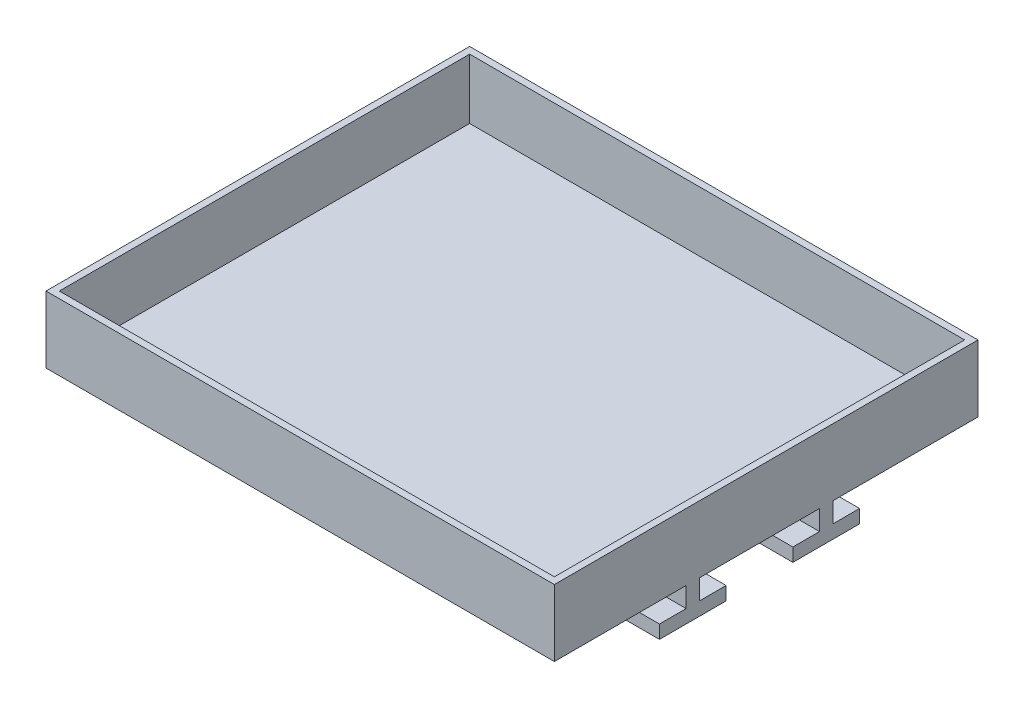
ISO-10303-21;
HEADER;
FILE_DESCRIPTION(('STEP AP214'),'2;1');
FILE_NAME('part.step','',(''),(''),'','','');
FILE_SCHEMA(('AUTOMOTIVE_DESIGN { 1 0 10303 214 1 1 1 1 }'));
ENDSEC;
DATA;
#1=APPLICATION_CONTEXT('core data for automotive mechanical design processes');
#2=APPLICATION_PROTOCOL_DEFINITION('international standard','automotive_design',2000,#1);
#3=PRODUCT_CONTEXT('',#1,'mechanical');
#4=PRODUCT('Part','Part','',(#3));
#5=PRODUCT_RELATED_PRODUCT_CATEGORY('part','',(#4));
#6=PRODUCT_DEFINITION_FORMATION('','',#4);
#7=PRODUCT_DEFINITION_CONTEXT('part definition',#1,'design');
#8=PRODUCT_DEFINITION('design','',#6,#7);
#9=PRODUCT_DEFINITION_SHAPE('','',#8);
#10=(LENGTH_UNIT() NAMED_UNIT(*) SI_UNIT(.MILLI.,.METRE.));
#11=(NAMED_UNIT(*) PLANE_ANGLE_UNIT() SI_UNIT($,.RADIAN.));
#12=(NAMED_UNIT(*) SI_UNIT($,.STERADIAN.) SOLID_ANGLE_UNIT());
#13=UNCERTAINTY_MEASURE_WITH_UNIT(LENGTH_MEASURE(1.E-05),#10,'distance_accuracy_value','');
#14=(GEOMETRIC_REPRESENTATION_CONTEXT(3) GLOBAL_UNCERTAINTY_ASSIGNED_CONTEXT((#13)) GLOBAL_UNIT_ASSIGNED_CONTEXT((#10,
#11,#12)) REPRESENTATION_CONTEXT('',''));
#15=CARTESIAN_POINT('',(0.,0.,0.));
#16=DIRECTION('',(0.,0.,1.));
#17=DIRECTION('',(1.,0.,0.));
#18=AXIS2_PLACEMENT_3D('',#15,#16,#17);
#19=CARTESIAN_POINT('',(0.,0.,0.));
#20=DIRECTION('',(0.,1.,0.));
#21=DIRECTION('',(0.,0.,1.));
#22=AXIS2_PLACEMENT_3D('',#19,#20,#21);
#23=PLANE('',#22);
#24=DIRECTION('',(1.,0.,0.));
#25=VECTOR('',#24,1.);
#26=CARTESIAN_POINT('',(-49.2803398874989,0.,12.));
#27=LINE('',#26,#25);
#28=CARTESIAN_POINT('',(-38.1,0.,12.));
#29=VERTEX_POINT('',#28);
#30=CARTESIAN_POINT('',(38.1,0.,12.));
#31=VERTEX_POINT('',#30);
#32=EDGE_CURVE('E59',#29,#31,#27,.T.);
#33=ORIENTED_EDGE('',*,*,#32,.T.);
#34=DIRECTION('',(0.,0.,-1.));
#35=VECTOR('',#34,1.);
#36=CARTESIAN_POINT('',(38.1,0.,-31.75));
#37=LINE('',#36,#35);
#38=CARTESIAN_POINT('',(38.1,0.,31.75));
#39=VERTEX_POINT('',#38);
#40=EDGE_CURVE('E231',#39,#31,#37,.T.);
#41=ORIENTED_EDGE('',*,*,#40,.F.);
#42=DIRECTION('',(1.,0.,0.));
#43=VECTOR('',#42,1.);
#44=CARTESIAN_POINT('',(-38.1,0.,31.75));
#45=LINE('',#44,#43);
#46=CARTESIAN_POINT('',(-38.1,0.,31.75));
#47=VERTEX_POINT('',#46);
#48=EDGE_CURVE('E249',#47,#39,#45,.T.);
#49=ORIENTED_EDGE('',*,*,#48,.F.);
#50=DIRECTION('',(0.,0.,1.));
#51=VECTOR('',#50,1.);
#52=CARTESIAN_POINT('',(-38.1,0.,-31.75));
#53=LINE('',#52,#51);
#54=EDGE_CURVE('E244',#29,#47,#53,.T.);
#55=ORIENTED_EDGE('',*,*,#54,.F.);
#56=EDGE_LOOP('',(#33,#41,#49,#55));
#57=FACE_BOUND('',#56,.T.);
#58=ADVANCED_FACE('F43',(#57),#23,.F.);
#59=DIRECTION('',(1.,0.,0.));
#60=VECTOR('',#59,1.);
#61=CARTESIAN_POINT('',(-49.2803398874989,0.,-10.));
#62=LINE('',#61,#60);
#63=CARTESIAN_POINT('',(-38.1,0.,-10.));
#64=VERTEX_POINT('',#63);
#65=CARTESIAN_POINT('',(38.1,0.,-10.));
#66=VERTEX_POINT('',#65);
#67=EDGE_CURVE('E276',#64,#66,#62,.T.);
#68=ORIENTED_EDGE('',*,*,#67,.F.);
#69=CARTESIAN_POINT('',(-38.1,0.,-31.75));
#70=VERTEX_POINT('',#69);
#71=EDGE_CURVE('E245',#70,#64,#53,.T.);
#72=ORIENTED_EDGE('',*,*,#71,.F.);
#73=DIRECTION('',(-1.,0.,0.));
#74=VECTOR('',#73,1.);
#75=CARTESIAN_POINT('',(-38.1,0.,-31.75));
#76=LINE('',#75,#74);
#77=CARTESIAN_POINT('',(38.1,0.,-31.75));
#78=VERTEX_POINT('',#77);
#79=EDGE_CURVE('E236',#78,#70,#76,.T.);
#80=ORIENTED_EDGE('',*,*,#79,.F.);
#81=EDGE_CURVE('E232',#66,#78,#37,.T.);
#82=ORIENTED_EDGE('',*,*,#81,.F.);
#83=EDGE_LOOP('',(#68,#72,#80,#82));
#84=FACE_BOUND('',#83,.T.);
#85=ADVANCED_FACE('F274',(#84),#23,.F.);
#86=CARTESIAN_POINT('',(38.1,10.,-31.75));
#87=DIRECTION('',(-1.,0.,0.));
#88=DIRECTION('',(0.,0.,1.));
#89=AXIS2_PLACEMENT_3D('',#86,#87,#88);
#90=PLANE('',#89);
#91=ORIENTED_EDGE('',*,*,#40,.T.);
#92=DIRECTION('',(0.,1.,0.));
#93=VECTOR('',#92,1.);
#94=CARTESIAN_POINT('',(38.1,-3.,12.));
#95=LINE('',#94,#93);
#96=CARTESIAN_POINT('',(38.1,-3.,12.));
#97=VERTEX_POINT('',#96);
#98=EDGE_CURVE('E224',#97,#31,#95,.T.);
#99=ORIENTED_EDGE('',*,*,#98,.F.);
#100=DIRECTION('',(0.,0.,-1.));
#101=VECTOR('',#100,1.);
#102=CARTESIAN_POINT('',(38.1,-3.,16.));
#103=LINE('',#102,#101);
#104=CARTESIAN_POINT('',(38.1,-3.,16.));
#105=VERTEX_POINT('',#104);
#106=EDGE_CURVE('E477',#105,#97,#103,.T.);
#107=ORIENTED_EDGE('',*,*,#106,.F.);
#108=DIRECTION('',(0.,1.,0.));
#109=VECTOR('',#108,1.);
#110=CARTESIAN_POINT('',(38.1,-5.,16.));
#111=LINE('',#110,#109);
#112=CARTESIAN_POINT('',(38.1,-5.,16.));
#113=VERTEX_POINT('',#112);
#114=EDGE_CURVE('E481',#113,#105,#111,.T.);
#115=ORIENTED_EDGE('',*,*,#114,.F.);
#116=DIRECTION('',(0.,0.,-1.));
#117=VECTOR('',#116,1.);
#118=CARTESIAN_POINT('',(38.1,-5.,16.));
#119=LINE('',#118,#117);
#120=CARTESIAN_POINT('',(38.1,-5.,6.));
#121=VERTEX_POINT('',#120);
#122=EDGE_CURVE('E485',#113,#121,#119,.T.);
#123=ORIENTED_EDGE('',*,*,#122,.T.);
#124=DIRECTION('',(0.,1.,0.));
#125=VECTOR('',#124,1.);
#126=CARTESIAN_POINT('',(38.1,-5.,6.));
#127=LINE('',#126,#125);
#128=CARTESIAN_POINT('',(38.1,-3.,6.));
#129=VERTEX_POINT('',#128);
#130=EDGE_CURVE('E489',#121,#129,#127,.T.);
#131=ORIENTED_EDGE('',*,*,#130,.T.);
#132=DIRECTION('',(0.,0.,-1.));
#133=VECTOR('',#132,1.);
#134=CARTESIAN_POINT('',(38.1,-3.,10.));
#135=LINE('',#134,#133);
#136=CARTESIAN_POINT('',(38.1,-3.,10.));
#137=VERTEX_POINT('',#136);
#138=EDGE_CURVE('E217',#137,#129,#135,.T.);
#139=ORIENTED_EDGE('',*,*,#138,.F.);
#140=DIRECTION('',(0.,1.,0.));
#141=VECTOR('',#140,1.);
#142=CARTESIAN_POINT('',(38.1,-3.,10.));
#143=LINE('',#142,#141);
#144=CARTESIAN_POINT('',(38.1,0.,10.));
#145=VERTEX_POINT('',#144);
#146=EDGE_CURVE('E211',#137,#145,#143,.T.);
#147=ORIENTED_EDGE('',*,*,#146,.T.);
#148=CARTESIAN_POINT('',(38.1,0.,-8.));
#149=VERTEX_POINT('',#148);
#150=EDGE_CURVE('E67',#145,#149,#37,.T.);
#151=ORIENTED_EDGE('',*,*,#150,.T.);
#152=DIRECTION('',(0.,1.,0.));
#153=VECTOR('',#152,1.);
#154=CARTESIAN_POINT('',(38.1,-3.,-8.));
#155=LINE('',#154,#153);
#156=CARTESIAN_POINT('',(38.1,-3.,-8.));
#157=VERTEX_POINT('',#156);
#158=EDGE_CURVE('E537',#157,#149,#155,.T.);
#159=ORIENTED_EDGE('',*,*,#158,.F.);
#160=DIRECTION('',(0.,0.,-1.));
#161=VECTOR('',#160,1.);
#162=CARTESIAN_POINT('',(38.1,-3.,-4.));
#163=LINE('',#162,#161);
#164=CARTESIAN_POINT('',(38.1,-3.,-4.));
#165=VERTEX_POINT('',#164);
#166=EDGE_CURVE('E540',#165,#157,#163,.T.);
#167=ORIENTED_EDGE('',*,*,#166,.F.);
#168=DIRECTION('',(0.,1.,0.));
#169=VECTOR('',#168,1.);
#170=CARTESIAN_POINT('',(38.1,-5.,-4.));
#171=LINE('',#170,#169);
#172=CARTESIAN_POINT('',(38.1,-5.,-4.));
#173=VERTEX_POINT('',#172);
#174=EDGE_CURVE('E544',#173,#165,#171,.T.);
#175=ORIENTED_EDGE('',*,*,#174,.F.);
#176=DIRECTION('',(0.,0.,-1.));
#177=VECTOR('',#176,1.);
#178=CARTESIAN_POINT('',(38.1,-5.,-4.));
#179=LINE('',#178,#177);
#180=CARTESIAN_POINT('',(38.1,-5.,-14.));
#181=VERTEX_POINT('',#180);
#182=EDGE_CURVE('E548',#173,#181,#179,.T.);
#183=ORIENTED_EDGE('',*,*,#182,.T.);
#184=DIRECTION('',(0.,1.,0.));
#185=VECTOR('',#184,1.);
#186=CARTESIAN_POINT('',(38.1,-5.,-14.));
#187=LINE('',#186,#185);
#188=CARTESIAN_POINT('',(38.1,-3.,-14.));
#189=VERTEX_POINT('',#188);
#190=EDGE_CURVE('E288',#181,#189,#187,.T.);
#191=ORIENTED_EDGE('',*,*,#190,.T.);
#192=DIRECTION('',(0.,0.,-1.));
#193=VECTOR('',#192,1.);
#194=CARTESIAN_POINT('',(38.1,-3.,-10.));
#195=LINE('',#194,#193);
#196=CARTESIAN_POINT('',(38.1,-3.,-10.));
#197=VERTEX_POINT('',#196);
#198=EDGE_CURVE('E281',#197,#189,#195,.T.);
#199=ORIENTED_EDGE('',*,*,#198,.F.);
#200=DIRECTION('',(0.,1.,0.));
#201=VECTOR('',#200,1.);
#202=CARTESIAN_POINT('',(38.1,-3.,-10.));
#203=LINE('',#202,#201);
#204=EDGE_CURVE('E473',#197,#66,#203,.T.);
#205=ORIENTED_EDGE('',*,*,#204,.T.);
#206=ORIENTED_EDGE('',*,*,#81,.T.);
#207=DIRECTION('',(0.,-1.,0.));
#208=VECTOR('',#207,1.);
#209=CARTESIAN_POINT('',(38.1,10.,-31.75));
#210=LINE('',#209,#208);
#211=CARTESIAN_POINT('',(38.1,10.,-31.75));
#212=VERTEX_POINT('',#211);
#213=EDGE_CURVE('E11',#212,#78,#210,.T.);
#214=ORIENTED_EDGE('',*,*,#213,.F.);
#215=DIRECTION('',(0.,0.,-1.));
#216=VECTOR('',#215,1.);
#217=CARTESIAN_POINT('',(38.1,10.,-31.75));
#218=LINE('',#217,#216);
#219=CARTESIAN_POINT('',(38.1,10.,31.75));
#220=VERTEX_POINT('',#219);
#221=EDGE_CURVE('E253',#220,#212,#218,.T.);
#222=ORIENTED_EDGE('',*,*,#221,.F.);
#223=DIRECTION('',(0.,-1.,0.));
#224=VECTOR('',#223,1.);
#225=CARTESIAN_POINT('',(38.1,10.,31.75));
#226=LINE('',#225,#224);
#227=EDGE_CURVE('E254',#220,#39,#226,.T.);
#228=ORIENTED_EDGE('',*,*,#227,.T.);
#229=EDGE_LOOP('',(#91,#99,#107,#115,#123,#131,#139,#147,#151,#159,#167,#175,#183,#191,#199,
#205,#206,#214,#222,#228));
#230=FACE_BOUND('',#229,.T.);
#231=ADVANCED_FACE('F45',(#230),#90,.F.);
#232=CARTESIAN_POINT('',(-38.1,10.,-31.75));
#233=DIRECTION('',(0.,0.,1.));
#234=DIRECTION('',(1.,0.,0.));
#235=AXIS2_PLACEMENT_3D('',#232,#233,#234);
#236=PLANE('',#235);
#237=ORIENTED_EDGE('',*,*,#79,.T.);
#238=DIRECTION('',(0.,-1.,0.));
#239=VECTOR('',#238,1.);
#240=CARTESIAN_POINT('',(-38.1,10.,-31.75));
#241=LINE('',#240,#239);
#242=CARTESIAN_POINT('',(-38.1,10.,-31.75));
#243=VERTEX_POINT('',#242);
#244=EDGE_CURVE('E52',#243,#70,#241,.T.);
#245=ORIENTED_EDGE('',*,*,#244,.F.);
#246=DIRECTION('',(-1.,0.,0.));
#247=VECTOR('',#246,1.);
#248=CARTESIAN_POINT('',(-38.1,10.,-31.75));
#249=LINE('',#248,#247);
#250=EDGE_CURVE('E337',#212,#243,#249,.T.);
#251=ORIENTED_EDGE('',*,*,#250,.F.);
#252=ORIENTED_EDGE('',*,*,#213,.T.);
#253=EDGE_LOOP('',(#237,#245,#251,#252));
#254=FACE_BOUND('',#253,.T.);
#255=ADVANCED_FACE('F351',(#254),#236,.F.);
#256=CARTESIAN_POINT('',(-38.1,10.,-31.75));
#257=DIRECTION('',(1.,0.,0.));
#258=DIRECTION('',(0.,0.,-1.));
#259=AXIS2_PLACEMENT_3D('',#256,#257,#258);
#260=PLANE('',#259);
#261=ORIENTED_EDGE('',*,*,#71,.T.);
#262=DIRECTION('',(0.,-1.,0.));
#263=VECTOR('',#262,1.);
#264=CARTESIAN_POINT('',(-38.1,-3.,-10.));
#265=LINE('',#264,#263);
#266=CARTESIAN_POINT('',(-38.1,-3.,-10.));
#267=VERTEX_POINT('',#266);
#268=EDGE_CURVE('E297',#64,#267,#265,.T.);
#269=ORIENTED_EDGE('',*,*,#268,.T.);
#270=DIRECTION('',(0.,0.,1.));
#271=VECTOR('',#270,1.);
#272=CARTESIAN_POINT('',(-38.1,-3.,-10.));
#273=LINE('',#272,#271);
#274=CARTESIAN_POINT('',(-38.1,-3.,-14.));
#275=VERTEX_POINT('',#274);
#276=EDGE_CURVE('E529',#275,#267,#273,.T.);
#277=ORIENTED_EDGE('',*,*,#276,.F.);
#278=DIRECTION('',(0.,-1.,0.));
#279=VECTOR('',#278,1.);
#280=CARTESIAN_POINT('',(-38.1,-5.,-14.));
#281=LINE('',#280,#279);
#282=CARTESIAN_POINT('',(-38.1,-5.,-14.));
#283=VERTEX_POINT('',#282);
#284=EDGE_CURVE('E526',#275,#283,#281,.T.);
#285=ORIENTED_EDGE('',*,*,#284,.T.);
#286=DIRECTION('',(0.,0.,1.));
#287=VECTOR('',#286,1.);
#288=CARTESIAN_POINT('',(-38.1,-5.,-4.));
#289=LINE('',#288,#287);
#290=CARTESIAN_POINT('',(-38.1,-5.,-4.));
#291=VERTEX_POINT('',#290);
#292=EDGE_CURVE('E523',#283,#291,#289,.T.);
#293=ORIENTED_EDGE('',*,*,#292,.T.);
#294=DIRECTION('',(0.,-1.,0.));
#295=VECTOR('',#294,1.);
#296=CARTESIAN_POINT('',(-38.1,-5.,-4.));
#297=LINE('',#296,#295);
#298=CARTESIAN_POINT('',(-38.1,-3.,-4.));
#299=VERTEX_POINT('',#298);
#300=EDGE_CURVE('E519',#299,#291,#297,.T.);
#301=ORIENTED_EDGE('',*,*,#300,.F.);
#302=DIRECTION('',(0.,0.,1.));
#303=VECTOR('',#302,1.);
#304=CARTESIAN_POINT('',(-38.1,-3.,-4.));
#305=LINE('',#304,#303);
#306=CARTESIAN_POINT('',(-38.1,-3.,-8.));
#307=VERTEX_POINT('',#306);
#308=EDGE_CURVE('E514',#307,#299,#305,.T.);
#309=ORIENTED_EDGE('',*,*,#308,.F.);
#310=DIRECTION('',(0.,-1.,0.));
#311=VECTOR('',#310,1.);
#312=CARTESIAN_POINT('',(-38.1,-3.,-8.));
#313=LINE('',#312,#311);
#314=CARTESIAN_POINT('',(-38.1,0.,-8.));
#315=VERTEX_POINT('',#314);
#316=EDGE_CURVE('E510',#315,#307,#313,.T.);
#317=ORIENTED_EDGE('',*,*,#316,.F.);
#318=CARTESIAN_POINT('',(-38.1,0.,10.));
#319=VERTEX_POINT('',#318);
#320=EDGE_CURVE('E250',#315,#319,#53,.T.);
#321=ORIENTED_EDGE('',*,*,#320,.T.);
#322=DIRECTION('',(0.,-1.,0.));
#323=VECTOR('',#322,1.);
#324=CARTESIAN_POINT('',(-38.1,-3.,10.));
#325=LINE('',#324,#323);
#326=CARTESIAN_POINT('',(-38.1,-3.,10.));
#327=VERTEX_POINT('',#326);
#328=EDGE_CURVE('E212',#319,#327,#325,.T.);
#329=ORIENTED_EDGE('',*,*,#328,.T.);
#330=DIRECTION('',(0.,0.,1.));
#331=VECTOR('',#330,1.);
#332=CARTESIAN_POINT('',(-38.1,-3.,10.));
#333=LINE('',#332,#331);
#334=CARTESIAN_POINT('',(-38.1,-3.,6.));
#335=VERTEX_POINT('',#334);
#336=EDGE_CURVE('E453',#335,#327,#333,.T.);
#337=ORIENTED_EDGE('',*,*,#336,.F.);
#338=DIRECTION('',(0.,-1.,0.));
#339=VECTOR('',#338,1.);
#340=CARTESIAN_POINT('',(-38.1,-5.,6.));
#341=LINE('',#340,#339);
#342=CARTESIAN_POINT('',(-38.1,-5.,6.));
#343=VERTEX_POINT('',#342);
#344=EDGE_CURVE('E460',#335,#343,#341,.T.);
#345=ORIENTED_EDGE('',*,*,#344,.T.);
#346=DIRECTION('',(0.,0.,1.));
#347=VECTOR('',#346,1.);
#348=CARTESIAN_POINT('',(-38.1,-5.,16.));
#349=LINE('',#348,#347);
#350=CARTESIAN_POINT('',(-38.1,-5.,16.));
#351=VERTEX_POINT('',#350);
#352=EDGE_CURVE('E463',#343,#351,#349,.T.);
#353=ORIENTED_EDGE('',*,*,#352,.T.);
#354=DIRECTION('',(0.,-1.,0.));
#355=VECTOR('',#354,1.);
#356=CARTESIAN_POINT('',(-38.1,-5.,16.));
#357=LINE('',#356,#355);
#358=CARTESIAN_POINT('',(-38.1,-3.,16.));
#359=VERTEX_POINT('',#358);
#360=EDGE_CURVE('E468',#359,#351,#357,.T.);
#361=ORIENTED_EDGE('',*,*,#360,.F.);
#362=DIRECTION('',(0.,0.,1.));
#363=VECTOR('',#362,1.);
#364=CARTESIAN_POINT('',(-38.1,-3.,16.));
#365=LINE('',#364,#363);
#366=CARTESIAN_POINT('',(-38.1,-3.,12.));
#367=VERTEX_POINT('',#366);
#368=EDGE_CURVE('E591',#367,#359,#365,.T.);
#369=ORIENTED_EDGE('',*,*,#368,.F.);
#370=DIRECTION('',(0.,-1.,0.));
#371=VECTOR('',#370,1.);
#372=CARTESIAN_POINT('',(-38.1,-3.,12.));
#373=LINE('',#372,#371);
#374=EDGE_CURVE('E495',#29,#367,#373,.T.);
#375=ORIENTED_EDGE('',*,*,#374,.F.);
#376=ORIENTED_EDGE('',*,*,#54,.T.);
#377=DIRECTION('',(0.,-1.,0.));
#378=VECTOR('',#377,1.);
#379=CARTESIAN_POINT('',(-38.1,10.,31.75));
#380=LINE('',#379,#378);
#381=CARTESIAN_POINT('',(-38.1,10.,31.75));
#382=VERTEX_POINT('',#381);
#383=EDGE_CURVE('E258',#382,#47,#380,.T.);
#384=ORIENTED_EDGE('',*,*,#383,.F.);
#385=DIRECTION('',(0.,0.,1.));
#386=VECTOR('',#385,1.);
#387=CARTESIAN_POINT('',(-38.1,10.,-31.75));
#388=LINE('',#387,#386);
#389=EDGE_CURVE('E269',#243,#382,#388,.T.);
#390=ORIENTED_EDGE('',*,*,#389,.F.);
#391=ORIENTED_EDGE('',*,*,#244,.T.);
#392=EDGE_LOOP('',(#261,#269,#277,#285,#293,#301,#309,#317,#321,#329,#337,#345,#353,#361,#369,
#375,#376,#384,#390,#391));
#393=FACE_BOUND('',#392,.T.);
#394=ADVANCED_FACE('F267',(#393),#260,.F.);
#395=CARTESIAN_POINT('',(-38.1,10.,31.75));
#396=DIRECTION('',(0.,0.,-1.));
#397=DIRECTION('',(-1.,0.,0.));
#398=AXIS2_PLACEMENT_3D('',#395,#396,#397);
#399=PLANE('',#398);
#400=ORIENTED_EDGE('',*,*,#48,.T.);
#401=ORIENTED_EDGE('',*,*,#227,.F.);
#402=DIRECTION('',(1.,0.,0.));
#403=VECTOR('',#402,1.);
#404=CARTESIAN_POINT('',(-38.1,10.,31.75));
#405=LINE('',#404,#403);
#406=EDGE_CURVE('E240',#382,#220,#405,.T.);
#407=ORIENTED_EDGE('',*,*,#406,.F.);
#408=ORIENTED_EDGE('',*,*,#383,.T.);
#409=EDGE_LOOP('',(#400,#401,#407,#408));
#410=FACE_BOUND('',#409,.T.);
#411=ADVANCED_FACE('F348',(#410),#399,.F.);
#412=CARTESIAN_POINT('',(0.,10.,0.));
#413=DIRECTION('',(0.,1.,0.));
#414=DIRECTION('',(0.,0.,1.));
#415=AXIS2_PLACEMENT_3D('',#412,#413,#414);
#416=PLANE('',#415);
#417=DIRECTION('',(0.,0.,-1.));
#418=VECTOR('',#417,1.);
#419=CARTESIAN_POINT('',(37.1,10.,-31.75));
#420=LINE('',#419,#418);
#421=CARTESIAN_POINT('',(37.1,10.,30.75));
#422=VERTEX_POINT('',#421);
#423=CARTESIAN_POINT('',(37.1,10.,-30.75));
#424=VERTEX_POINT('',#423);
#425=EDGE_CURVE('E322',#422,#424,#420,.T.);
#426=ORIENTED_EDGE('',*,*,#425,.F.);
#427=DIRECTION('',(1.,0.,0.));
#428=VECTOR('',#427,1.);
#429=CARTESIAN_POINT('',(-38.1,10.,30.75));
#430=LINE('',#429,#428);
#431=CARTESIAN_POINT('',(-37.1,10.,30.75));
#432=VERTEX_POINT('',#431);
#433=EDGE_CURVE('E307',#432,#422,#430,.T.);
#434=ORIENTED_EDGE('',*,*,#433,.F.);
#435=DIRECTION('',(0.,0.,1.));
#436=VECTOR('',#435,1.);
#437=CARTESIAN_POINT('',(-37.1,10.,-31.75));
#438=LINE('',#437,#436);
#439=CARTESIAN_POINT('',(-37.1,10.,-30.75));
#440=VERTEX_POINT('',#439);
#441=EDGE_CURVE('E328',#440,#432,#438,.T.);
#442=ORIENTED_EDGE('',*,*,#441,.F.);
#443=DIRECTION('',(-1.,0.,0.));
#444=VECTOR('',#443,1.);
#445=CARTESIAN_POINT('',(-38.1,10.,-30.75));
#446=LINE('',#445,#444);
#447=EDGE_CURVE('E325',#424,#440,#446,.T.);
#448=ORIENTED_EDGE('',*,*,#447,.F.);
#449=EDGE_LOOP('',(#426,#434,#442,#448));
#450=FACE_BOUND('',#449,.T.);
#451=ORIENTED_EDGE('',*,*,#221,.T.);
#452=ORIENTED_EDGE('',*,*,#250,.T.);
#453=ORIENTED_EDGE('',*,*,#389,.T.);
#454=ORIENTED_EDGE('',*,*,#406,.T.);
#455=EDGE_LOOP('',(#451,#452,#453,#454));
#456=FACE_BOUND('',#455,.T.);
#457=ADVANCED_FACE('F344',(#450,#456),#416,.T.);
#458=ORIENTED_EDGE('',*,*,#150,.F.);
#459=DIRECTION('',(1.,0.,0.));
#460=VECTOR('',#459,1.);
#461=CARTESIAN_POINT('',(-49.2803398874989,0.,10.));
#462=LINE('',#461,#460);
#463=EDGE_CURVE('E208',#319,#145,#462,.T.);
#464=ORIENTED_EDGE('',*,*,#463,.F.);
#465=ORIENTED_EDGE('',*,*,#320,.F.);
#466=DIRECTION('',(1.,0.,0.));
#467=VECTOR('',#466,1.);
#468=CARTESIAN_POINT('',(-49.2803398874989,0.,-8.));
#469=LINE('',#468,#467);
#470=EDGE_CURVE('E229',#315,#149,#469,.T.);
#471=ORIENTED_EDGE('',*,*,#470,.T.);
#472=EDGE_LOOP('',(#458,#464,#465,#471));
#473=FACE_BOUND('',#472,.T.);
#474=ADVANCED_FACE('F227',(#473),#23,.F.);
#475=CARTESIAN_POINT('',(37.1,10.,-31.75));
#476=DIRECTION('',(-1.,0.,0.));
#477=DIRECTION('',(0.,0.,1.));
#478=AXIS2_PLACEMENT_3D('',#475,#476,#477);
#479=PLANE('',#478);
#480=DIRECTION('',(0.,0.,-1.));
#481=VECTOR('',#480,1.);
#482=CARTESIAN_POINT('',(37.1,0.999999999999999,-31.75));
#483=LINE('',#482,#481);
#484=CARTESIAN_POINT('',(37.1,1.,30.75));
#485=VERTEX_POINT('',#484);
#486=CARTESIAN_POINT('',(37.1,1.,-30.75));
#487=VERTEX_POINT('',#486);
#488=EDGE_CURVE('E292',#485,#487,#483,.T.);
#489=ORIENTED_EDGE('',*,*,#488,.F.);
#490=DIRECTION('',(0.,-1.,0.));
#491=VECTOR('',#490,1.);
#492=CARTESIAN_POINT('',(37.1,10.,30.75));
#493=LINE('',#492,#491);
#494=EDGE_CURVE('E302',#422,#485,#493,.T.);
#495=ORIENTED_EDGE('',*,*,#494,.F.);
#496=ORIENTED_EDGE('',*,*,#425,.T.);
#497=DIRECTION('',(0.,-1.,0.));
#498=VECTOR('',#497,1.);
#499=CARTESIAN_POINT('',(37.1,10.,-30.75));
#500=LINE('',#499,#498);
#501=EDGE_CURVE('E237',#424,#487,#500,.T.);
#502=ORIENTED_EDGE('',*,*,#501,.T.);
#503=EDGE_LOOP('',(#489,#495,#496,#502));
#504=FACE_BOUND('',#503,.T.);
#505=ADVANCED_FACE('F367',(#504),#479,.T.);
#506=CARTESIAN_POINT('',(-38.1,10.,-30.75));
#507=DIRECTION('',(0.,0.,1.));
#508=DIRECTION('',(1.,0.,0.));
#509=AXIS2_PLACEMENT_3D('',#506,#507,#508);
#510=PLANE('',#509);
#511=DIRECTION('',(-1.,0.,0.));
#512=VECTOR('',#511,1.);
#513=CARTESIAN_POINT('',(-38.1,0.999999999999999,-30.75));
#514=LINE('',#513,#512);
#515=CARTESIAN_POINT('',(-37.1,1.,-30.75));
#516=VERTEX_POINT('',#515);
#517=EDGE_CURVE('E296',#487,#516,#514,.T.);
#518=ORIENTED_EDGE('',*,*,#517,.F.);
#519=ORIENTED_EDGE('',*,*,#501,.F.);
#520=ORIENTED_EDGE('',*,*,#447,.T.);
#521=DIRECTION('',(0.,-1.,0.));
#522=VECTOR('',#521,1.);
#523=CARTESIAN_POINT('',(-37.1,10.,-30.75));
#524=LINE('',#523,#522);
#525=EDGE_CURVE('E301',#440,#516,#524,.T.);
#526=ORIENTED_EDGE('',*,*,#525,.T.);
#527=EDGE_LOOP('',(#518,#519,#520,#526));
#528=FACE_BOUND('',#527,.T.);
#529=ADVANCED_FACE('F372',(#528),#510,.T.);
#530=CARTESIAN_POINT('',(-37.1,10.,-31.75));
#531=DIRECTION('',(1.,0.,0.));
#532=DIRECTION('',(0.,0.,-1.));
#533=AXIS2_PLACEMENT_3D('',#530,#531,#532);
#534=PLANE('',#533);
#535=DIRECTION('',(0.,0.,1.));
#536=VECTOR('',#535,1.);
#537=CARTESIAN_POINT('',(-37.1,0.999999999999999,-31.75));
#538=LINE('',#537,#536);
#539=CARTESIAN_POINT('',(-37.1,1.,30.75));
#540=VERTEX_POINT('',#539);
#541=EDGE_CURVE('E310',#516,#540,#538,.T.);
#542=ORIENTED_EDGE('',*,*,#541,.F.);
#543=ORIENTED_EDGE('',*,*,#525,.F.);
#544=ORIENTED_EDGE('',*,*,#441,.T.);
#545=DIRECTION('',(0.,-1.,0.));
#546=VECTOR('',#545,1.);
#547=CARTESIAN_POINT('',(-37.1,10.,30.75));
#548=LINE('',#547,#546);
#549=EDGE_CURVE('E306',#432,#540,#548,.T.);
#550=ORIENTED_EDGE('',*,*,#549,.T.);
#551=EDGE_LOOP('',(#542,#543,#544,#550));
#552=FACE_BOUND('',#551,.T.);
#553=ADVANCED_FACE('F389',(#552),#534,.T.);
#554=CARTESIAN_POINT('',(-38.1,10.,30.75));
#555=DIRECTION('',(0.,0.,-1.));
#556=DIRECTION('',(-1.,0.,0.));
#557=AXIS2_PLACEMENT_3D('',#554,#555,#556);
#558=PLANE('',#557);
#559=DIRECTION('',(1.,0.,0.));
#560=VECTOR('',#559,1.);
#561=CARTESIAN_POINT('',(-38.1,0.999999999999999,30.75));
#562=LINE('',#561,#560);
#563=EDGE_CURVE('E316',#540,#485,#562,.T.);
#564=ORIENTED_EDGE('',*,*,#563,.F.);
#565=ORIENTED_EDGE('',*,*,#549,.F.);
#566=ORIENTED_EDGE('',*,*,#433,.T.);
#567=ORIENTED_EDGE('',*,*,#494,.T.);
#568=EDGE_LOOP('',(#564,#565,#566,#567));
#569=FACE_BOUND('',#568,.T.);
#570=ADVANCED_FACE('F385',(#569),#558,.T.);
#571=CARTESIAN_POINT('',(0.,1.,0.));
#572=DIRECTION('',(0.,1.,0.));
#573=DIRECTION('',(0.,0.,1.));
#574=AXIS2_PLACEMENT_3D('',#571,#572,#573);
#575=PLANE('',#574);
#576=ORIENTED_EDGE('',*,*,#488,.T.);
#577=ORIENTED_EDGE('',*,*,#517,.T.);
#578=ORIENTED_EDGE('',*,*,#541,.T.);
#579=ORIENTED_EDGE('',*,*,#563,.T.);
#580=EDGE_LOOP('',(#576,#577,#578,#579));
#581=FACE_BOUND('',#580,.T.);
#582=ADVANCED_FACE('F381',(#581),#575,.T.);
#583=CARTESIAN_POINT('',(-49.2803398874989,-3.,-8.));
#584=DIRECTION('',(0.,0.,-1.));
#585=DIRECTION('',(-1.,0.,0.));
#586=AXIS2_PLACEMENT_3D('',#583,#584,#585);
#587=PLANE('',#586);
#588=ORIENTED_EDGE('',*,*,#470,.F.);
#589=ORIENTED_EDGE('',*,*,#316,.T.);
#590=DIRECTION('',(1.,0.,0.));
#591=VECTOR('',#590,1.);
#592=CARTESIAN_POINT('',(-49.2803398874989,-3.,-8.));
#593=LINE('',#592,#591);
#594=EDGE_CURVE('E285',#307,#157,#593,.T.);
#595=ORIENTED_EDGE('',*,*,#594,.T.);
#596=ORIENTED_EDGE('',*,*,#158,.T.);
#597=EDGE_LOOP('',(#588,#589,#595,#596));
#598=FACE_BOUND('',#597,.T.);
#599=ADVANCED_FACE('F384',(#598),#587,.F.);
#600=CARTESIAN_POINT('',(-49.2803398874989,-3.,-4.));
#601=DIRECTION('',(0.,-1.,0.));
#602=DIRECTION('',(0.,0.,-1.));
#603=AXIS2_PLACEMENT_3D('',#600,#601,#602);
#604=PLANE('',#603);
#605=ORIENTED_EDGE('',*,*,#594,.F.);
#606=ORIENTED_EDGE('',*,*,#308,.T.);
#607=DIRECTION('',(1.,0.,0.));
#608=VECTOR('',#607,1.);
#609=CARTESIAN_POINT('',(-49.2803398874989,-3.,-4.));
#610=LINE('',#609,#608);
#611=EDGE_CURVE('E566',#299,#165,#610,.T.);
#612=ORIENTED_EDGE('',*,*,#611,.T.);
#613=ORIENTED_EDGE('',*,*,#166,.T.);
#614=EDGE_LOOP('',(#605,#606,#612,#613));
#615=FACE_BOUND('',#614,.T.);
#616=ADVANCED_FACE('F404',(#615),#604,.F.);
#617=CARTESIAN_POINT('',(-49.2803398874989,-5.,-4.));
#618=DIRECTION('',(0.,0.,-1.));
#619=DIRECTION('',(0.,1.,0.));
#620=AXIS2_PLACEMENT_3D('',#617,#618,#619);
#621=PLANE('',#620);
#622=ORIENTED_EDGE('',*,*,#611,.F.);
#623=ORIENTED_EDGE('',*,*,#300,.T.);
#624=DIRECTION('',(1.,0.,0.));
#625=VECTOR('',#624,1.);
#626=CARTESIAN_POINT('',(-49.2803398874989,-5.,-4.));
#627=LINE('',#626,#625);
#628=EDGE_CURVE('E563',#291,#173,#627,.T.);
#629=ORIENTED_EDGE('',*,*,#628,.T.);
#630=ORIENTED_EDGE('',*,*,#174,.T.);
#631=EDGE_LOOP('',(#622,#623,#629,#630));
#632=FACE_BOUND('',#631,.T.);
#633=ADVANCED_FACE('F408',(#632),#621,.F.);
#634=CARTESIAN_POINT('',(-49.2803398874989,-5.,-4.));
#635=DIRECTION('',(0.,-1.,0.));
#636=DIRECTION('',(0.,0.,-1.));
#637=AXIS2_PLACEMENT_3D('',#634,#635,#636);
#638=PLANE('',#637);
#639=ORIENTED_EDGE('',*,*,#292,.F.);
#640=DIRECTION('',(1.,0.,0.));
#641=VECTOR('',#640,1.);
#642=CARTESIAN_POINT('',(-49.2803398874989,-5.,-14.));
#643=LINE('',#642,#641);
#644=EDGE_CURVE('E560',#283,#181,#643,.T.);
#645=ORIENTED_EDGE('',*,*,#644,.T.);
#646=ORIENTED_EDGE('',*,*,#182,.F.);
#647=ORIENTED_EDGE('',*,*,#628,.F.);
#648=EDGE_LOOP('',(#639,#645,#646,#647));
#649=FACE_BOUND('',#648,.T.);
#650=ADVANCED_FACE('F412',(#649),#638,.T.);
#651=CARTESIAN_POINT('',(-49.2803398874989,-5.,-14.));
#652=DIRECTION('',(0.,0.,-1.));
#653=DIRECTION('',(0.,1.,0.));
#654=AXIS2_PLACEMENT_3D('',#651,#652,#653);
#655=PLANE('',#654);
#656=ORIENTED_EDGE('',*,*,#284,.F.);
#657=DIRECTION('',(1.,0.,0.));
#658=VECTOR('',#657,1.);
#659=CARTESIAN_POINT('',(-49.2803398874989,-3.,-14.));
#660=LINE('',#659,#658);
#661=EDGE_CURVE('E557',#275,#189,#660,.T.);
#662=ORIENTED_EDGE('',*,*,#661,.T.);
#663=ORIENTED_EDGE('',*,*,#190,.F.);
#664=ORIENTED_EDGE('',*,*,#644,.F.);
#665=EDGE_LOOP('',(#656,#662,#663,#664));
#666=FACE_BOUND('',#665,.T.);
#667=ADVANCED_FACE('F416',(#666),#655,.T.);
#668=CARTESIAN_POINT('',(-49.2803398874989,-3.,-10.));
#669=DIRECTION('',(0.,-1.,0.));
#670=DIRECTION('',(0.,0.,-1.));
#671=AXIS2_PLACEMENT_3D('',#668,#669,#670);
#672=PLANE('',#671);
#673=ORIENTED_EDGE('',*,*,#661,.F.);
#674=ORIENTED_EDGE('',*,*,#276,.T.);
#675=DIRECTION('',(1.,0.,0.));
#676=VECTOR('',#675,1.);
#677=CARTESIAN_POINT('',(-49.2803398874989,-3.,-10.));
#678=LINE('',#677,#676);
#679=EDGE_CURVE('E515',#267,#197,#678,.T.);
#680=ORIENTED_EDGE('',*,*,#679,.T.);
#681=ORIENTED_EDGE('',*,*,#198,.T.);
#682=EDGE_LOOP('',(#673,#674,#680,#681));
#683=FACE_BOUND('',#682,.T.);
#684=ADVANCED_FACE('F401',(#683),#672,.F.);
#685=CARTESIAN_POINT('',(-49.2803398874989,-3.,-10.));
#686=DIRECTION('',(0.,0.,-1.));
#687=DIRECTION('',(0.,1.,0.));
#688=AXIS2_PLACEMENT_3D('',#685,#686,#687);
#689=PLANE('',#688);
#690=ORIENTED_EDGE('',*,*,#268,.F.);
#691=ORIENTED_EDGE('',*,*,#67,.T.);
#692=ORIENTED_EDGE('',*,*,#204,.F.);
#693=ORIENTED_EDGE('',*,*,#679,.F.);
#694=EDGE_LOOP('',(#690,#691,#692,#693));
#695=FACE_BOUND('',#694,.T.);
#696=ADVANCED_FACE('F397',(#695),#689,.T.);
#697=CARTESIAN_POINT('',(-49.2803398874989,-3.,12.));
#698=DIRECTION('',(0.,0.,-1.));
#699=DIRECTION('',(-1.,0.,0.));
#700=AXIS2_PLACEMENT_3D('',#697,#698,#699);
#701=PLANE('',#700);
#702=ORIENTED_EDGE('',*,*,#32,.F.);
#703=ORIENTED_EDGE('',*,*,#374,.T.);
#704=DIRECTION('',(1.,0.,0.));
#705=VECTOR('',#704,1.);
#706=CARTESIAN_POINT('',(-49.2803398874989,-3.,12.));
#707=LINE('',#706,#705);
#708=EDGE_CURVE('E505',#367,#97,#707,.T.);
#709=ORIENTED_EDGE('',*,*,#708,.T.);
#710=ORIENTED_EDGE('',*,*,#98,.T.);
#711=EDGE_LOOP('',(#702,#703,#709,#710));
#712=FACE_BOUND('',#711,.T.);
#713=ADVANCED_FACE('F400',(#712),#701,.F.);
#714=CARTESIAN_POINT('',(-49.2803398874989,-3.,16.));
#715=DIRECTION('',(0.,-1.,0.));
#716=DIRECTION('',(0.,0.,-1.));
#717=AXIS2_PLACEMENT_3D('',#714,#715,#716);
#718=PLANE('',#717);
#719=ORIENTED_EDGE('',*,*,#708,.F.);
#720=ORIENTED_EDGE('',*,*,#368,.T.);
#721=DIRECTION('',(1.,0.,0.));
#722=VECTOR('',#721,1.);
#723=CARTESIAN_POINT('',(-49.2803398874989,-3.,16.));
#724=LINE('',#723,#722);
#725=EDGE_CURVE('E502',#359,#105,#724,.T.);
#726=ORIENTED_EDGE('',*,*,#725,.T.);
#727=ORIENTED_EDGE('',*,*,#106,.T.);
#728=EDGE_LOOP('',(#719,#720,#726,#727));
#729=FACE_BOUND('',#728,.T.);
#730=ADVANCED_FACE('F429',(#729),#718,.F.);
#731=CARTESIAN_POINT('',(-49.2803398874989,-5.,16.));
#732=DIRECTION('',(0.,0.,-1.));
#733=DIRECTION('',(0.,1.,0.));
#734=AXIS2_PLACEMENT_3D('',#731,#732,#733);
#735=PLANE('',#734);
#736=ORIENTED_EDGE('',*,*,#725,.F.);
#737=ORIENTED_EDGE('',*,*,#360,.T.);
#738=DIRECTION('',(1.,0.,0.));
#739=VECTOR('',#738,1.);
#740=CARTESIAN_POINT('',(-49.2803398874989,-5.,16.));
#741=LINE('',#740,#739);
#742=EDGE_CURVE('E499',#351,#113,#741,.T.);
#743=ORIENTED_EDGE('',*,*,#742,.T.);
#744=ORIENTED_EDGE('',*,*,#114,.T.);
#745=EDGE_LOOP('',(#736,#737,#743,#744));
#746=FACE_BOUND('',#745,.T.);
#747=ADVANCED_FACE('F432',(#746),#735,.F.);
#748=CARTESIAN_POINT('',(-49.2803398874989,-5.,16.));
#749=DIRECTION('',(0.,-1.,0.));
#750=DIRECTION('',(0.,0.,-1.));
#751=AXIS2_PLACEMENT_3D('',#748,#749,#750);
#752=PLANE('',#751);
#753=ORIENTED_EDGE('',*,*,#352,.F.);
#754=DIRECTION('',(1.,0.,0.));
#755=VECTOR('',#754,1.);
#756=CARTESIAN_POINT('',(-49.2803398874989,-5.,6.));
#757=LINE('',#756,#755);
#758=EDGE_CURVE('E457',#343,#121,#757,.T.);
#759=ORIENTED_EDGE('',*,*,#758,.T.);
#760=ORIENTED_EDGE('',*,*,#122,.F.);
#761=ORIENTED_EDGE('',*,*,#742,.F.);
#762=EDGE_LOOP('',(#753,#759,#760,#761));
#763=FACE_BOUND('',#762,.T.);
#764=ADVANCED_FACE('F436',(#763),#752,.T.);
#765=CARTESIAN_POINT('',(-49.2803398874989,-5.,6.));
#766=DIRECTION('',(0.,0.,-1.));
#767=DIRECTION('',(0.,1.,0.));
#768=AXIS2_PLACEMENT_3D('',#765,#766,#767);
#769=PLANE('',#768);
#770=ORIENTED_EDGE('',*,*,#344,.F.);
#771=DIRECTION('',(1.,0.,0.));
#772=VECTOR('',#771,1.);
#773=CARTESIAN_POINT('',(-49.2803398874989,-3.,6.));
#774=LINE('',#773,#772);
#775=EDGE_CURVE('E451',#335,#129,#774,.T.);
#776=ORIENTED_EDGE('',*,*,#775,.T.);
#777=ORIENTED_EDGE('',*,*,#130,.F.);
#778=ORIENTED_EDGE('',*,*,#758,.F.);
#779=EDGE_LOOP('',(#770,#776,#777,#778));
#780=FACE_BOUND('',#779,.T.);
#781=ADVANCED_FACE('F440',(#780),#769,.T.);
#782=CARTESIAN_POINT('',(-49.2803398874989,-3.,10.));
#783=DIRECTION('',(0.,-1.,0.));
#784=DIRECTION('',(0.,0.,-1.));
#785=AXIS2_PLACEMENT_3D('',#782,#783,#784);
#786=PLANE('',#785);
#787=ORIENTED_EDGE('',*,*,#775,.F.);
#788=ORIENTED_EDGE('',*,*,#336,.T.);
#789=DIRECTION('',(1.,0.,0.));
#790=VECTOR('',#789,1.);
#791=CARTESIAN_POINT('',(-49.2803398874989,-3.,10.));
#792=LINE('',#791,#790);
#793=EDGE_CURVE('E456',#327,#137,#792,.T.);
#794=ORIENTED_EDGE('',*,*,#793,.T.);
#795=ORIENTED_EDGE('',*,*,#138,.T.);
#796=EDGE_LOOP('',(#787,#788,#794,#795));
#797=FACE_BOUND('',#796,.T.);
#798=ADVANCED_FACE('F426',(#797),#786,.F.);
#799=CARTESIAN_POINT('',(-49.2803398874989,-3.,10.));
#800=DIRECTION('',(0.,0.,-1.));
#801=DIRECTION('',(0.,1.,0.));
#802=AXIS2_PLACEMENT_3D('',#799,#800,#801);
#803=PLANE('',#802);
#804=ORIENTED_EDGE('',*,*,#328,.F.);
#805=ORIENTED_EDGE('',*,*,#463,.T.);
#806=ORIENTED_EDGE('',*,*,#146,.F.);
#807=ORIENTED_EDGE('',*,*,#793,.F.);
#808=EDGE_LOOP('',(#804,#805,#806,#807));
#809=FACE_BOUND('',#808,.T.);
#810=ADVANCED_FACE('F209',(#809),#803,.T.);
#811=CLOSED_SHELL('',(#58,#85,#231,#255,#394,#411,#457,#474,#505,#529,#553,#570,#582,#599,#616,
#633,#650,#667,#684,#696,#713,#730,#747,#764,#781,#798,#810));
#812=MANIFOLD_SOLID_BREP('B2',#811);
#813=ADVANCED_BREP_SHAPE_REPRESENTATION('',(#18,#812),#14);
#814=SHAPE_DEFINITION_REPRESENTATION(#9,#813);
ENDSEC;
END-ISO-10303-21;
